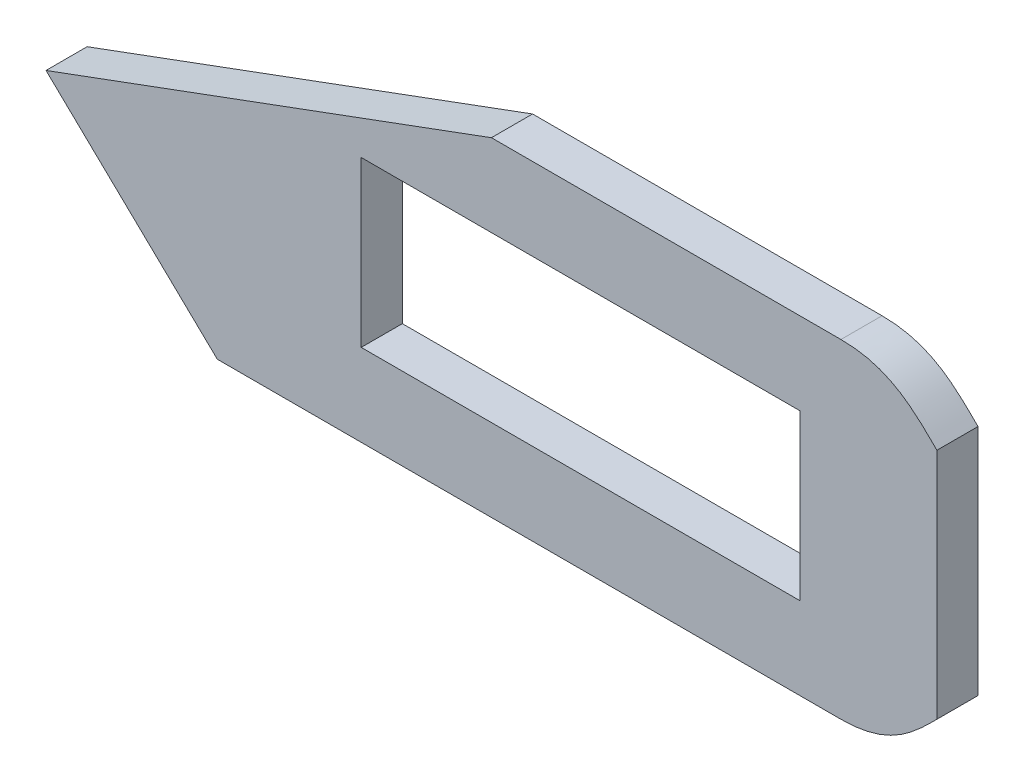
ISO-10303-21;
HEADER;
FILE_DESCRIPTION(('STEP AP214'),'2;1');
FILE_NAME('part.step','',(''),(''),'','','');
FILE_SCHEMA(('AUTOMOTIVE_DESIGN { 1 0 10303 214 1 1 1 1 }'));
ENDSEC;
DATA;
#1=APPLICATION_CONTEXT('core data for automotive mechanical design processes');
#2=APPLICATION_PROTOCOL_DEFINITION('international standard','automotive_design',2000,#1);
#3=PRODUCT_CONTEXT('',#1,'mechanical');
#4=PRODUCT('Part','Part','',(#3));
#5=PRODUCT_RELATED_PRODUCT_CATEGORY('part','',(#4));
#6=PRODUCT_DEFINITION_FORMATION('','',#4);
#7=PRODUCT_DEFINITION_CONTEXT('part definition',#1,'design');
#8=PRODUCT_DEFINITION('design','',#6,#7);
#9=PRODUCT_DEFINITION_SHAPE('','',#8);
#10=(LENGTH_UNIT() NAMED_UNIT(*) SI_UNIT(.MILLI.,.METRE.));
#11=(NAMED_UNIT(*) PLANE_ANGLE_UNIT() SI_UNIT($,.RADIAN.));
#12=(NAMED_UNIT(*) SI_UNIT($,.STERADIAN.) SOLID_ANGLE_UNIT());
#13=UNCERTAINTY_MEASURE_WITH_UNIT(LENGTH_MEASURE(1.E-05),#10,'distance_accuracy_value','');
#14=(GEOMETRIC_REPRESENTATION_CONTEXT(3) GLOBAL_UNCERTAINTY_ASSIGNED_CONTEXT((#13)) GLOBAL_UNIT_ASSIGNED_CONTEXT((#10,
#11,#12)) REPRESENTATION_CONTEXT('',''));
#15=CARTESIAN_POINT('',(0.,0.,0.));
#16=DIRECTION('',(0.,0.,1.));
#17=DIRECTION('',(1.,0.,0.));
#18=AXIS2_PLACEMENT_3D('',#15,#16,#17);
#19=CARTESIAN_POINT('',(0.,-12.,3.));
#20=DIRECTION('',(0.,-1.,0.));
#21=DIRECTION('',(1.,0.,0.));
#22=AXIS2_PLACEMENT_3D('',#19,#20,#21);
#23=PLANE('',#22);
#24=DIRECTION('',(-1.,0.,0.));
#25=VECTOR('',#24,1.);
#26=CARTESIAN_POINT('',(0.,-12.,0.));
#27=LINE('',#26,#25);
#28=CARTESIAN_POINT('',(23.5985424972736,-12.,0.));
#29=VERTEX_POINT('',#28);
#30=CARTESIAN_POINT('',(-21.9014575027261,-12.,0.));
#31=VERTEX_POINT('',#30);
#32=EDGE_CURVE('E167',#29,#31,#27,.T.);
#33=ORIENTED_EDGE('',*,*,#32,.F.);
#34=DIRECTION('',(0.,0.,-1.));
#35=VECTOR('',#34,1.);
#36=CARTESIAN_POINT('',(23.5985424972736,-12.,3.));
#37=LINE('',#36,#35);
#38=CARTESIAN_POINT('',(23.5985424972736,-12.,3.));
#39=VERTEX_POINT('',#38);
#40=EDGE_CURVE('E11',#39,#29,#37,.T.);
#41=ORIENTED_EDGE('',*,*,#40,.F.);
#42=DIRECTION('',(-1.,0.,0.));
#43=VECTOR('',#42,1.);
#44=CARTESIAN_POINT('',(0.,-12.,3.));
#45=LINE('',#44,#43);
#46=CARTESIAN_POINT('',(-21.9014575027261,-12.,3.));
#47=VERTEX_POINT('',#46);
#48=EDGE_CURVE('E250',#39,#47,#45,.T.);
#49=ORIENTED_EDGE('',*,*,#48,.T.);
#50=DIRECTION('',(0.,0.,-1.));
#51=VECTOR('',#50,1.);
#52=CARTESIAN_POINT('',(-21.9014575027261,-12.,3.));
#53=LINE('',#52,#51);
#54=EDGE_CURVE('E97',#47,#31,#53,.T.);
#55=ORIENTED_EDGE('',*,*,#54,.T.);
#56=EDGE_LOOP('',(#33,#41,#49,#55));
#57=FACE_BOUND('',#56,.T.);
#58=ADVANCED_FACE('F35',(#57),#23,.T.);
#59=CARTESIAN_POINT('',(23.5985424972736,-12.,3.));
#60=CARTESIAN_POINT('',(30.5985424972736,-12.,3.));
#61=CARTESIAN_POINT('',(30.5985424972736,-5.,3.));
#62=CARTESIAN_POINT('',(37.5985424972736,-5.,3.));
#63=B_SPLINE_CURVE_WITH_KNOTS('',3,(#59,#60,#61,#62),.UNSPECIFIED.,.F.,.F.,(4,4),(0.,1.),.UNSPECIFIED.);
#64=DIRECTION('',(0.,0.,-1.));
#65=VECTOR('',#64,1.);
#66=SURFACE_OF_LINEAR_EXTRUSION('',#63,#65);
#67=CARTESIAN_POINT('',(23.5985424972736,-12.,0.));
#68=CARTESIAN_POINT('',(30.5985424972736,-12.,0.));
#69=CARTESIAN_POINT('',(30.5985424972736,-5.,0.));
#70=CARTESIAN_POINT('',(37.5985424972736,-5.,0.));
#71=B_SPLINE_CURVE_WITH_KNOTS('',3,(#67,#68,#69,#70),.UNSPECIFIED.,.F.,.F.,(4,4),(0.,1.),.UNSPECIFIED.);
#72=CARTESIAN_POINT('',(30.5985424972736,-8.5,0.));
#73=VERTEX_POINT('',#72);
#74=EDGE_CURVE('E170',#29,#73,#71,.T.);
#75=ORIENTED_EDGE('',*,*,#74,.T.);
#76=DIRECTION('',(0.,0.,-1.));
#77=VECTOR('',#76,1.);
#78=CARTESIAN_POINT('',(30.5985424972736,-8.5,3.));
#79=LINE('',#78,#77);
#80=CARTESIAN_POINT('',(30.5985424972736,-8.5,3.));
#81=VERTEX_POINT('',#80);
#82=EDGE_CURVE('E45',#81,#73,#79,.T.);
#83=ORIENTED_EDGE('',*,*,#82,.F.);
#84=EDGE_CURVE('E243',#39,#81,#63,.T.);
#85=ORIENTED_EDGE('',*,*,#84,.F.);
#86=ORIENTED_EDGE('',*,*,#40,.T.);
#87=EDGE_LOOP('',(#75,#83,#85,#86));
#88=FACE_BOUND('',#87,.T.);
#89=ADVANCED_FACE('F232',(#88),#66,.F.);
#90=CARTESIAN_POINT('',(30.5985424972736,0.,3.));
#91=DIRECTION('',(1.,0.,0.));
#92=DIRECTION('',(0.,1.,0.));
#93=AXIS2_PLACEMENT_3D('',#90,#91,#92);
#94=PLANE('',#93);
#95=DIRECTION('',(0.,-1.,0.));
#96=VECTOR('',#95,1.);
#97=CARTESIAN_POINT('',(30.5985424972736,0.,0.));
#98=LINE('',#97,#96);
#99=CARTESIAN_POINT('',(30.5985424972736,8.50000000000001,0.));
#100=VERTEX_POINT('',#99);
#101=EDGE_CURVE('E175',#100,#73,#98,.T.);
#102=ORIENTED_EDGE('',*,*,#101,.F.);
#103=DIRECTION('',(0.,0.,-1.));
#104=VECTOR('',#103,1.);
#105=CARTESIAN_POINT('',(30.5985424972736,8.50000000000001,3.));
#106=LINE('',#105,#104);
#107=CARTESIAN_POINT('',(30.5985424972736,8.50000000000001,3.));
#108=VERTEX_POINT('',#107);
#109=EDGE_CURVE('E198',#108,#100,#106,.T.);
#110=ORIENTED_EDGE('',*,*,#109,.F.);
#111=DIRECTION('',(0.,-1.,0.));
#112=VECTOR('',#111,1.);
#113=CARTESIAN_POINT('',(30.5985424972736,0.,3.));
#114=LINE('',#113,#112);
#115=EDGE_CURVE('E249',#108,#81,#114,.T.);
#116=ORIENTED_EDGE('',*,*,#115,.T.);
#117=ORIENTED_EDGE('',*,*,#82,.T.);
#118=EDGE_LOOP('',(#102,#110,#116,#117));
#119=FACE_BOUND('',#118,.T.);
#120=ADVANCED_FACE('F237',(#119),#94,.T.);
#121=CARTESIAN_POINT('',(23.5985424972736,12.,3.));
#122=CARTESIAN_POINT('',(30.5985424972736,12.,3.));
#123=CARTESIAN_POINT('',(30.5985424972736,5.,3.));
#124=CARTESIAN_POINT('',(37.5985424972736,5.,3.));
#125=B_SPLINE_CURVE_WITH_KNOTS('',3,(#121,#122,#123,#124),.UNSPECIFIED.,.F.,.F.,(4,4),(0.,1.),.UNSPECIFIED.);
#126=DIRECTION('',(0.,0.,-1.));
#127=VECTOR('',#126,1.);
#128=SURFACE_OF_LINEAR_EXTRUSION('',#125,#127);
#129=CARTESIAN_POINT('',(23.5985424972736,12.,0.));
#130=CARTESIAN_POINT('',(30.5985424972736,12.,0.));
#131=CARTESIAN_POINT('',(30.5985424972736,5.,0.));
#132=CARTESIAN_POINT('',(37.5985424972736,5.,0.));
#133=B_SPLINE_CURVE_WITH_KNOTS('',3,(#129,#130,#131,#132),.UNSPECIFIED.,.F.,.F.,(4,4),(0.,1.),.UNSPECIFIED.);
#134=CARTESIAN_POINT('',(23.5985424972736,12.,0.));
#135=VERTEX_POINT('',#134);
#136=EDGE_CURVE('E181',#135,#100,#133,.T.);
#137=ORIENTED_EDGE('',*,*,#136,.F.);
#138=DIRECTION('',(0.,0.,-1.));
#139=VECTOR('',#138,1.);
#140=CARTESIAN_POINT('',(23.5985424972736,12.,3.));
#141=LINE('',#140,#139);
#142=CARTESIAN_POINT('',(23.5985424972736,12.,3.));
#143=VERTEX_POINT('',#142);
#144=EDGE_CURVE('E147',#143,#135,#141,.T.);
#145=ORIENTED_EDGE('',*,*,#144,.F.);
#146=EDGE_CURVE('E136',#143,#108,#125,.T.);
#147=ORIENTED_EDGE('',*,*,#146,.T.);
#148=ORIENTED_EDGE('',*,*,#109,.T.);
#149=EDGE_LOOP('',(#137,#145,#147,#148));
#150=FACE_BOUND('',#149,.T.);
#151=ADVANCED_FACE('F262',(#150),#128,.T.);
#152=CARTESIAN_POINT('',(0.,12.,3.));
#153=DIRECTION('',(0.,-1.,0.));
#154=DIRECTION('',(1.,0.,0.));
#155=AXIS2_PLACEMENT_3D('',#152,#153,#154);
#156=PLANE('',#155);
#157=DIRECTION('',(-1.,0.,0.));
#158=VECTOR('',#157,1.);
#159=CARTESIAN_POINT('',(0.,12.,0.));
#160=LINE('',#159,#158);
#161=CARTESIAN_POINT('',(-1.90145750272643,12.,0.));
#162=VERTEX_POINT('',#161);
#163=EDGE_CURVE('E143',#135,#162,#160,.T.);
#164=ORIENTED_EDGE('',*,*,#163,.T.);
#165=DIRECTION('',(0.,0.,-1.));
#166=VECTOR('',#165,1.);
#167=CARTESIAN_POINT('',(-1.90145750272643,12.,3.));
#168=LINE('',#167,#166);
#169=CARTESIAN_POINT('',(-1.90145750272643,12.,3.));
#170=VERTEX_POINT('',#169);
#171=EDGE_CURVE('E140',#170,#162,#168,.T.);
#172=ORIENTED_EDGE('',*,*,#171,.F.);
#173=DIRECTION('',(-1.,0.,0.));
#174=VECTOR('',#173,1.);
#175=CARTESIAN_POINT('',(0.,12.,3.));
#176=LINE('',#175,#174);
#177=EDGE_CURVE('E129',#143,#170,#176,.T.);
#178=ORIENTED_EDGE('',*,*,#177,.F.);
#179=ORIENTED_EDGE('',*,*,#144,.T.);
#180=EDGE_LOOP('',(#164,#172,#178,#179));
#181=FACE_BOUND('',#180,.T.);
#182=ADVANCED_FACE('F141',(#181),#156,.F.);
#183=CARTESIAN_POINT('',(-4.12731504302654,11.1781449081969,3.));
#184=DIRECTION('',(-0.346374082759159,0.938096474139388,0.));
#185=DIRECTION('',(-0.938096474139388,-0.346374082759159,0.));
#186=AXIS2_PLACEMENT_3D('',#183,#184,#185);
#187=PLANE('',#186);
#188=DIRECTION('',(0.938096474139388,0.346374082759159,0.));
#189=VECTOR('',#188,1.);
#190=CARTESIAN_POINT('',(-4.12731504302654,11.1781449081969,0.));
#191=LINE('',#190,#189);
#192=CARTESIAN_POINT('',(-34.4014575027264,0.,0.));
#193=VERTEX_POINT('',#192);
#194=EDGE_CURVE('E190',#193,#162,#191,.T.);
#195=ORIENTED_EDGE('',*,*,#194,.F.);
#196=DIRECTION('',(0.,0.,-1.));
#197=VECTOR('',#196,1.);
#198=CARTESIAN_POINT('',(-34.4014575027264,0.,3.));
#199=LINE('',#198,#197);
#200=CARTESIAN_POINT('',(-34.4014575027264,0.,3.));
#201=VERTEX_POINT('',#200);
#202=EDGE_CURVE('E90',#201,#193,#199,.T.);
#203=ORIENTED_EDGE('',*,*,#202,.F.);
#204=DIRECTION('',(0.938096474139388,0.346374082759159,0.));
#205=VECTOR('',#204,1.);
#206=CARTESIAN_POINT('',(-4.12731504302654,11.1781449081969,3.));
#207=LINE('',#206,#205);
#208=EDGE_CURVE('E133',#201,#170,#207,.T.);
#209=ORIENTED_EDGE('',*,*,#208,.T.);
#210=ORIENTED_EDGE('',*,*,#171,.T.);
#211=EDGE_LOOP('',(#195,#203,#209,#210));
#212=FACE_BOUND('',#211,.T.);
#213=ADVANCED_FACE('F149',(#212),#187,.T.);
#214=CARTESIAN_POINT('',(0.,6.,3.));
#215=DIRECTION('',(0.,1.,0.));
#216=DIRECTION('',(-1.,0.,0.));
#217=AXIS2_PLACEMENT_3D('',#214,#215,#216);
#218=PLANE('',#217);
#219=DIRECTION('',(1.,0.,0.));
#220=VECTOR('',#219,1.);
#221=CARTESIAN_POINT('',(0.,6.,0.));
#222=LINE('',#221,#220);
#223=CARTESIAN_POINT('',(-11.4014575027264,6.,0.));
#224=VERTEX_POINT('',#223);
#225=CARTESIAN_POINT('',(20.5985424972736,6.,0.));
#226=VERTEX_POINT('',#225);
#227=EDGE_CURVE('E155',#224,#226,#222,.T.);
#228=ORIENTED_EDGE('',*,*,#227,.T.);
#229=DIRECTION('',(0.,0.,-1.));
#230=VECTOR('',#229,1.);
#231=CARTESIAN_POINT('',(20.5985424972736,6.,3.));
#232=LINE('',#231,#230);
#233=CARTESIAN_POINT('',(20.5985424972736,6.,3.));
#234=VERTEX_POINT('',#233);
#235=EDGE_CURVE('E39',#234,#226,#232,.T.);
#236=ORIENTED_EDGE('',*,*,#235,.F.);
#237=DIRECTION('',(1.,0.,0.));
#238=VECTOR('',#237,1.);
#239=CARTESIAN_POINT('',(0.,6.,3.));
#240=LINE('',#239,#238);
#241=CARTESIAN_POINT('',(-11.4014575027264,6.,3.));
#242=VERTEX_POINT('',#241);
#243=EDGE_CURVE('E194',#242,#234,#240,.T.);
#244=ORIENTED_EDGE('',*,*,#243,.F.);
#245=DIRECTION('',(0.,0.,-1.));
#246=VECTOR('',#245,1.);
#247=CARTESIAN_POINT('',(-11.4014575027264,6.,3.));
#248=LINE('',#247,#246);
#249=EDGE_CURVE('E151',#242,#224,#248,.T.);
#250=ORIENTED_EDGE('',*,*,#249,.T.);
#251=EDGE_LOOP('',(#228,#236,#244,#250));
#252=FACE_BOUND('',#251,.T.);
#253=ADVANCED_FACE('F37',(#252),#218,.F.);
#254=CARTESIAN_POINT('',(20.5985424972736,0.,3.));
#255=DIRECTION('',(1.,0.,0.));
#256=DIRECTION('',(0.,0.,-1.));
#257=AXIS2_PLACEMENT_3D('',#254,#255,#256);
#258=PLANE('',#257);
#259=DIRECTION('',(0.,-1.,0.));
#260=VECTOR('',#259,1.);
#261=CARTESIAN_POINT('',(20.5985424972736,0.,0.));
#262=LINE('',#261,#260);
#263=CARTESIAN_POINT('',(20.5985424972736,-6.,0.));
#264=VERTEX_POINT('',#263);
#265=EDGE_CURVE('E158',#226,#264,#262,.T.);
#266=ORIENTED_EDGE('',*,*,#265,.T.);
#267=DIRECTION('',(0.,0.,-1.));
#268=VECTOR('',#267,1.);
#269=CARTESIAN_POINT('',(20.5985424972736,-6.,3.));
#270=LINE('',#269,#268);
#271=CARTESIAN_POINT('',(20.5985424972736,-6.,3.));
#272=VERTEX_POINT('',#271);
#273=EDGE_CURVE('E203',#272,#264,#270,.T.);
#274=ORIENTED_EDGE('',*,*,#273,.F.);
#275=DIRECTION('',(0.,-1.,0.));
#276=VECTOR('',#275,1.);
#277=CARTESIAN_POINT('',(20.5985424972736,0.,3.));
#278=LINE('',#277,#276);
#279=EDGE_CURVE('E105',#234,#272,#278,.T.);
#280=ORIENTED_EDGE('',*,*,#279,.F.);
#281=ORIENTED_EDGE('',*,*,#235,.T.);
#282=EDGE_LOOP('',(#266,#274,#280,#281));
#283=FACE_BOUND('',#282,.T.);
#284=ADVANCED_FACE('F208',(#283),#258,.F.);
#285=CARTESIAN_POINT('',(0.,-6.,3.));
#286=DIRECTION('',(0.,1.,0.));
#287=DIRECTION('',(-1.,0.,0.));
#288=AXIS2_PLACEMENT_3D('',#285,#286,#287);
#289=PLANE('',#288);
#290=DIRECTION('',(1.,0.,0.));
#291=VECTOR('',#290,1.);
#292=CARTESIAN_POINT('',(0.,-6.,0.));
#293=LINE('',#292,#291);
#294=CARTESIAN_POINT('',(-11.4014575027264,-6.,0.));
#295=VERTEX_POINT('',#294);
#296=EDGE_CURVE('E161',#295,#264,#293,.T.);
#297=ORIENTED_EDGE('',*,*,#296,.F.);
#298=DIRECTION('',(0.,0.,-1.));
#299=VECTOR('',#298,1.);
#300=CARTESIAN_POINT('',(-11.4014575027264,-6.,3.));
#301=LINE('',#300,#299);
#302=CARTESIAN_POINT('',(-11.4014575027264,-6.,3.));
#303=VERTEX_POINT('',#302);
#304=EDGE_CURVE('E202',#303,#295,#301,.T.);
#305=ORIENTED_EDGE('',*,*,#304,.F.);
#306=DIRECTION('',(1.,0.,0.));
#307=VECTOR('',#306,1.);
#308=CARTESIAN_POINT('',(0.,-6.,3.));
#309=LINE('',#308,#307);
#310=EDGE_CURVE('E279',#303,#272,#309,.T.);
#311=ORIENTED_EDGE('',*,*,#310,.T.);
#312=ORIENTED_EDGE('',*,*,#273,.T.);
#313=EDGE_LOOP('',(#297,#305,#311,#312));
#314=FACE_BOUND('',#313,.T.);
#315=ADVANCED_FACE('F222',(#314),#289,.T.);
#316=CARTESIAN_POINT('',(-11.4014575027264,0.,3.));
#317=DIRECTION('',(1.,0.,0.));
#318=DIRECTION('',(0.,0.,-1.));
#319=AXIS2_PLACEMENT_3D('',#316,#317,#318);
#320=PLANE('',#319);
#321=DIRECTION('',(0.,-1.,0.));
#322=VECTOR('',#321,1.);
#323=CARTESIAN_POINT('',(-11.4014575027264,0.,0.));
#324=LINE('',#323,#322);
#325=EDGE_CURVE('E164',#224,#295,#324,.T.);
#326=ORIENTED_EDGE('',*,*,#325,.F.);
#327=ORIENTED_EDGE('',*,*,#249,.F.);
#328=DIRECTION('',(0.,-1.,0.));
#329=VECTOR('',#328,1.);
#330=CARTESIAN_POINT('',(-11.4014575027264,0.,3.));
#331=LINE('',#330,#329);
#332=EDGE_CURVE('E220',#242,#303,#331,.T.);
#333=ORIENTED_EDGE('',*,*,#332,.T.);
#334=ORIENTED_EDGE('',*,*,#304,.T.);
#335=EDGE_LOOP('',(#326,#327,#333,#334));
#336=FACE_BOUND('',#335,.T.);
#337=ADVANCED_FACE('F217',(#336),#320,.T.);
#338=CARTESIAN_POINT('',(-16.4989504759117,-17.1864067457418,3.));
#339=DIRECTION('',(0.692531828189704,0.72138732103096,0.));
#340=DIRECTION('',(-0.72138732103096,0.692531828189704,0.));
#341=AXIS2_PLACEMENT_3D('',#338,#339,#340);
#342=PLANE('',#341);
#343=DIRECTION('',(0.72138732103096,-0.692531828189704,0.));
#344=VECTOR('',#343,1.);
#345=CARTESIAN_POINT('',(-16.4989504759117,-17.1864067457418,0.));
#346=LINE('',#345,#344);
#347=EDGE_CURVE('E192',#193,#31,#346,.T.);
#348=ORIENTED_EDGE('',*,*,#347,.T.);
#349=ORIENTED_EDGE('',*,*,#54,.F.);
#350=DIRECTION('',(0.72138732103096,-0.692531828189704,0.));
#351=VECTOR('',#350,1.);
#352=CARTESIAN_POINT('',(-16.4989504759117,-17.1864067457418,3.));
#353=LINE('',#352,#351);
#354=EDGE_CURVE('E54',#201,#47,#353,.T.);
#355=ORIENTED_EDGE('',*,*,#354,.F.);
#356=ORIENTED_EDGE('',*,*,#202,.T.);
#357=EDGE_LOOP('',(#348,#349,#355,#356));
#358=FACE_BOUND('',#357,.T.);
#359=ADVANCED_FACE('F229',(#358),#342,.F.);
#360=CARTESIAN_POINT('',(0.,0.,3.));
#361=DIRECTION('',(0.,0.,1.));
#362=DIRECTION('',(1.,0.,0.));
#363=AXIS2_PLACEMENT_3D('',#360,#361,#362);
#364=PLANE('',#363);
#365=ORIENTED_EDGE('',*,*,#243,.T.);
#366=ORIENTED_EDGE('',*,*,#279,.T.);
#367=ORIENTED_EDGE('',*,*,#310,.F.);
#368=ORIENTED_EDGE('',*,*,#332,.F.);
#369=EDGE_LOOP('',(#365,#366,#367,#368));
#370=FACE_BOUND('',#369,.T.);
#371=ORIENTED_EDGE('',*,*,#48,.F.);
#372=ORIENTED_EDGE('',*,*,#84,.T.);
#373=ORIENTED_EDGE('',*,*,#115,.F.);
#374=ORIENTED_EDGE('',*,*,#146,.F.);
#375=ORIENTED_EDGE('',*,*,#177,.T.);
#376=ORIENTED_EDGE('',*,*,#208,.F.);
#377=ORIENTED_EDGE('',*,*,#354,.T.);
#378=EDGE_LOOP('',(#371,#372,#373,#374,#375,#376,#377));
#379=FACE_BOUND('',#378,.T.);
#380=ADVANCED_FACE('F131',(#370,#379),#364,.T.);
#381=CARTESIAN_POINT('',(0.,0.,0.));
#382=DIRECTION('',(0.,0.,1.));
#383=DIRECTION('',(1.,0.,0.));
#384=AXIS2_PLACEMENT_3D('',#381,#382,#383);
#385=PLANE('',#384);
#386=ORIENTED_EDGE('',*,*,#227,.F.);
#387=ORIENTED_EDGE('',*,*,#325,.T.);
#388=ORIENTED_EDGE('',*,*,#296,.T.);
#389=ORIENTED_EDGE('',*,*,#265,.F.);
#390=EDGE_LOOP('',(#386,#387,#388,#389));
#391=FACE_BOUND('',#390,.T.);
#392=ORIENTED_EDGE('',*,*,#32,.T.);
#393=ORIENTED_EDGE('',*,*,#347,.F.);
#394=ORIENTED_EDGE('',*,*,#194,.T.);
#395=ORIENTED_EDGE('',*,*,#163,.F.);
#396=ORIENTED_EDGE('',*,*,#136,.T.);
#397=ORIENTED_EDGE('',*,*,#101,.T.);
#398=ORIENTED_EDGE('',*,*,#74,.F.);
#399=EDGE_LOOP('',(#392,#393,#394,#395,#396,#397,#398));
#400=FACE_BOUND('',#399,.T.);
#401=ADVANCED_FACE('F214',(#391,#400),#385,.F.);
#402=CLOSED_SHELL('',(#58,#89,#120,#151,#182,#213,#253,#284,#315,#337,#359,#380,#401));
#403=MANIFOLD_SOLID_BREP('B2',#402);
#404=ADVANCED_BREP_SHAPE_REPRESENTATION('',(#18,#403),#14);
#405=SHAPE_DEFINITION_REPRESENTATION(#9,#404);
ENDSEC;
END-ISO-10303-21;
